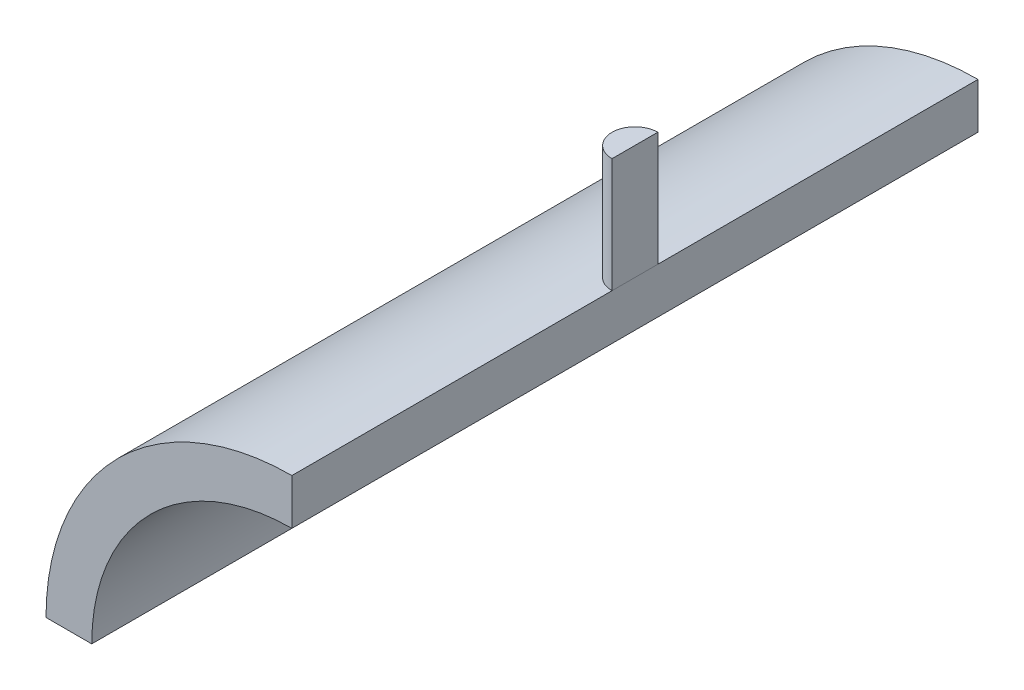
ISO-10303-21;
HEADER;
FILE_DESCRIPTION(('STEP AP214'),'2;1');
FILE_NAME('part.step','',(''),(''),'','','');
FILE_SCHEMA(('AUTOMOTIVE_DESIGN { 1 0 10303 214 1 1 1 1 }'));
ENDSEC;
DATA;
#1=APPLICATION_CONTEXT('core data for automotive mechanical design processes');
#2=APPLICATION_PROTOCOL_DEFINITION('international standard','automotive_design',2000,#1);
#3=PRODUCT_CONTEXT('',#1,'mechanical');
#4=PRODUCT('Part','Part','',(#3));
#5=PRODUCT_RELATED_PRODUCT_CATEGORY('part','',(#4));
#6=PRODUCT_DEFINITION_FORMATION('','',#4);
#7=PRODUCT_DEFINITION_CONTEXT('part definition',#1,'design');
#8=PRODUCT_DEFINITION('design','',#6,#7);
#9=PRODUCT_DEFINITION_SHAPE('','',#8);
#10=(LENGTH_UNIT() NAMED_UNIT(*) SI_UNIT(.MILLI.,.METRE.));
#11=(NAMED_UNIT(*) PLANE_ANGLE_UNIT() SI_UNIT($,.RADIAN.));
#12=(NAMED_UNIT(*) SI_UNIT($,.STERADIAN.) SOLID_ANGLE_UNIT());
#13=UNCERTAINTY_MEASURE_WITH_UNIT(LENGTH_MEASURE(1.E-05),#10,'distance_accuracy_value','');
#14=(GEOMETRIC_REPRESENTATION_CONTEXT(3) GLOBAL_UNCERTAINTY_ASSIGNED_CONTEXT((#13)) GLOBAL_UNIT_ASSIGNED_CONTEXT((#10,
#11,#12)) REPRESENTATION_CONTEXT('',''));
#15=CARTESIAN_POINT('',(0.,0.,0.));
#16=DIRECTION('',(0.,0.,1.));
#17=DIRECTION('',(1.,0.,0.));
#18=AXIS2_PLACEMENT_3D('',#15,#16,#17);
#19=CARTESIAN_POINT('',(0.,0.,76.2));
#20=DIRECTION('',(0.,0.,-1.));
#21=DIRECTION('',(-1.,0.,0.));
#22=AXIS2_PLACEMENT_3D('',#19,#20,#21);
#23=CYLINDRICAL_SURFACE('',#22,27.305);
#24=DIRECTION('',(0.,0.,-1.));
#25=VECTOR('',#24,1.);
#26=CARTESIAN_POINT('',(0.,27.305,35.56));
#27=LINE('',#26,#25);
#28=CARTESIAN_POINT('',(0.,27.305,40.64));
#29=VERTEX_POINT('',#28);
#30=CARTESIAN_POINT('',(0.,27.305,35.56));
#31=VERTEX_POINT('',#30);
#32=EDGE_CURVE('E12',#29,#31,#27,.T.);
#33=ORIENTED_EDGE('',*,*,#32,.F.);
#34=CARTESIAN_POINT('',(0.,27.305,35.56));
#35=CARTESIAN_POINT('',(-0.0712761745581656,27.305002704359,35.559992977723));
#36=CARTESIAN_POINT('',(-0.142548897038713,27.3047209710686,35.5630001352108));
#37=CARTESIAN_POINT('',(-0.28458143273031,27.3036086104742,35.5749884382365));
#38=CARTESIAN_POINT('',(-0.355341278320255,27.3027780181311,35.5839692032693));
#39=CARTESIAN_POINT('',(-0.495789516985236,27.3005888783886,35.6078398685261));
#40=CARTESIAN_POINT('',(-0.565478797075577,27.2992307956366,35.6227245684291));
#41=CARTESIAN_POINT('',(-0.703333163421718,27.2960273886493,35.6582799844524));
#42=CARTESIAN_POINT('',(-0.771498263081333,27.2941820687007,35.6789506496687));
#43=CARTESIAN_POINT('',(-0.973038770785745,27.2879864866015,35.7494659107561));
#44=CARTESIAN_POINT('',(-1.10352975776769,27.2829754296935,35.8078258023717));
#45=CARTESIAN_POINT('',(-1.35277461515994,27.2717555192625,35.9454935457507));
#46=CARTESIAN_POINT('',(-1.47153002473506,27.2655468231306,36.0247986454479));
#47=CARTESIAN_POINT('',(-1.69440518085302,27.2526056988025,36.2023869427999));
#48=CARTESIAN_POINT('',(-1.798484624796,27.2458719043398,36.3007207067473));
#49=CARTESIAN_POINT('',(-1.98869404359857,27.2326502648965,36.513473962815));
#50=CARTESIAN_POINT('',(-2.07482127601813,27.2261624576175,36.6278959081556));
#51=CARTESIAN_POINT('',(-2.22681699282527,27.2141535618347,36.8698257453777));
#52=CARTESIAN_POINT('',(-2.29264864154293,27.2086342388194,36.9973568772253));
#53=CARTESIAN_POINT('',(-2.40194373906475,27.1992043730304,37.2617148963497));
#54=CARTESIAN_POINT('',(-2.44540902335816,27.1952936982486,37.3985410197919));
#55=CARTESIAN_POINT('',(-2.50862211302221,27.1895357622463,37.6771922536974));
#56=CARTESIAN_POINT('',(-2.52843820540104,27.187682561159,37.8190017480177));
#57=CARTESIAN_POINT('',(-2.5440013936356,27.186230821562,38.1039485919509));
#58=CARTESIAN_POINT('',(-2.53974845292076,27.186632286478,38.247085943581));
#59=CARTESIAN_POINT('',(-2.50734984015752,27.1896391824742,38.530147991177));
#60=CARTESIAN_POINT('',(-2.47927927532233,27.1922376852585,38.6700813676771));
#61=CARTESIAN_POINT('',(-2.40015911412824,27.1993350170393,38.9432413143619));
#62=CARTESIAN_POINT('',(-2.34910935768062,27.2038338592748,39.0764678378149));
#63=CARTESIAN_POINT('',(-2.22539540347622,27.2142330499727,39.3326736791895));
#64=CARTESIAN_POINT('',(-2.15269728290109,27.2201355950813,39.4556365239417));
#65=CARTESIAN_POINT('',(-1.98777788437432,27.2326748504776,39.6876380791451));
#66=CARTESIAN_POINT('',(-1.89555699442021,27.2393115461736,39.7966770662515));
#67=CARTESIAN_POINT('',(-1.69380448534262,27.2526014698176,39.9981643004209));
#68=CARTESIAN_POINT('',(-1.58421039735372,27.2592546686998,40.0905500019832));
#69=CARTESIAN_POINT('',(-1.35099313670298,27.2718069402296,40.2556506940644));
#70=CARTESIAN_POINT('',(-1.22736569195286,27.2777057820645,40.3283596716007));
#71=CARTESIAN_POINT('',(-0.969532831636801,27.2880869537317,40.4520373538065));
#72=CARTESIAN_POINT('',(-0.835319682981221,27.2925682358043,40.5029899874157));
#73=CARTESIAN_POINT('',(-0.56029292449324,27.299595723035,40.5815433175172));
#74=CARTESIAN_POINT('',(-0.419489650561029,27.3021448572683,40.609179368438));
#75=CARTESIAN_POINT('',(-0.231422870442125,27.304058767318,40.6298634781072));
#76=CARTESIAN_POINT('',(-0.18517977183952,27.3044115191117,40.6336665793864));
#77=CARTESIAN_POINT('',(-0.0926308509235826,27.3048818410604,40.6387314024149));
#78=CARTESIAN_POINT('',(-0.046325262536238,27.3049998032111,40.6399973601063));
#79=CARTESIAN_POINT('',(0.,27.305,40.64));
#80=B_SPLINE_CURVE_WITH_KNOTS('',3,(#34,#35,#36,#37,#38,#39,#40,#41,#42,#43,#44,#45,#46,#47,#48,
#49,#50,#51,#52,#53,#54,#55,#56,#57,#58,#59,#60,#61,#62,#63,#64,#65,#66,#67,#68,#69,#70,#71,#72,
#73,#74,#75,#76,#77,#78,#79),.UNSPECIFIED.,.F.,.F.,(4,2,2,2,2,2,2,2,2,2,2,2,2,2,2,2,2,2,2,2,2,2,
4),(0.,0.213758377391474,0.427503140166232,0.641060048264209,0.854615077579251,1.28151363150623,
1.70835612157803,2.13634886734063,2.56440694687003,2.99323742203204,3.42203269973012,
3.84958681262588,4.27714157514931,4.70335306310955,5.12956752039574,5.55645339873055,
5.98333079388765,6.41177946422457,6.84035891612098,7.26925440734802,7.69749839888946,
7.83664993509868,7.9755689537086),.UNSPECIFIED.);
#81=EDGE_CURVE('E58',#31,#29,#80,.T.);
#82=ORIENTED_EDGE('',*,*,#81,.F.);
#83=EDGE_LOOP('',(#33,#82));
#84=FACE_BOUND('',#83,.T.);
#85=ADVANCED_FACE('F49',(#84),#23,.F.);
#86=CARTESIAN_POINT('',(0.,-0.00199999999999853,38.1));
#87=DIRECTION('',(0.,1.,0.));
#88=DIRECTION('',(0.,0.,1.));
#89=AXIS2_PLACEMENT_3D('',#86,#87,#88);
#90=CYLINDRICAL_SURFACE('',#89,2.54);
#91=ORIENTED_EDGE('',*,*,#81,.T.);
#92=DIRECTION('',(0.,-1.,0.));
#93=VECTOR('',#92,1.);
#94=CARTESIAN_POINT('',(0.,40.005,40.64));
#95=LINE('',#94,#93);
#96=CARTESIAN_POINT('',(0.,40.005,40.64));
#97=VERTEX_POINT('',#96);
#98=EDGE_CURVE('E78',#97,#29,#95,.T.);
#99=ORIENTED_EDGE('',*,*,#98,.F.);
#100=CARTESIAN_POINT('',(0.,40.005,38.1));
#101=DIRECTION('',(0.,1.,0.));
#102=DIRECTION('',(0.,0.,1.));
#103=AXIS2_PLACEMENT_3D('',#100,#101,#102);
#104=CIRCLE('',#103,2.54);
#105=CARTESIAN_POINT('',(0.,40.005,35.56));
#106=VERTEX_POINT('',#105);
#107=EDGE_CURVE('E83',#106,#97,#104,.T.);
#108=ORIENTED_EDGE('',*,*,#107,.F.);
#109=DIRECTION('',(0.,-1.,0.));
#110=VECTOR('',#109,1.);
#111=CARTESIAN_POINT('',(0.,40.005,35.56));
#112=LINE('',#111,#110);
#113=EDGE_CURVE('E81',#106,#31,#112,.T.);
#114=ORIENTED_EDGE('',*,*,#113,.T.);
#115=EDGE_LOOP('',(#91,#99,#108,#114));
#116=FACE_BOUND('',#115,.T.);
#117=ADVANCED_FACE('F51',(#116),#90,.T.);
#118=CARTESIAN_POINT('',(0.,40.005,35.56));
#119=DIRECTION('',(-1.,0.,0.));
#120=DIRECTION('',(0.,0.,1.));
#121=AXIS2_PLACEMENT_3D('',#118,#119,#120);
#122=PLANE('',#121);
#123=ORIENTED_EDGE('',*,*,#32,.T.);
#124=ORIENTED_EDGE('',*,*,#113,.F.);
#125=DIRECTION('',(0.,0.,-1.));
#126=VECTOR('',#125,1.);
#127=CARTESIAN_POINT('',(0.,40.005,35.56));
#128=LINE('',#127,#126);
#129=EDGE_CURVE('E72',#97,#106,#128,.T.);
#130=ORIENTED_EDGE('',*,*,#129,.F.);
#131=ORIENTED_EDGE('',*,*,#98,.T.);
#132=EDGE_LOOP('',(#123,#124,#130,#131));
#133=FACE_BOUND('',#132,.T.);
#134=ADVANCED_FACE('F80',(#133),#122,.F.);
#135=CARTESIAN_POINT('',(0.,40.005,38.1));
#136=DIRECTION('',(0.,1.,0.));
#137=DIRECTION('',(0.,0.,1.));
#138=AXIS2_PLACEMENT_3D('',#135,#136,#137);
#139=PLANE('',#138);
#140=ORIENTED_EDGE('',*,*,#107,.T.);
#141=ORIENTED_EDGE('',*,*,#129,.T.);
#142=EDGE_LOOP('',(#140,#141));
#143=FACE_BOUND('',#142,.T.);
#144=ADVANCED_FACE('F97',(#143),#139,.T.);
#145=CLOSED_SHELL('',(#85,#117,#134,#144));
#146=MANIFOLD_SOLID_BREP('B2',#145);
#147=CARTESIAN_POINT('',(0.,0.,76.2));
#148=DIRECTION('',(0.,0.,-1.));
#149=DIRECTION('',(-1.,0.,0.));
#150=AXIS2_PLACEMENT_3D('',#147,#148,#149);
#151=CYLINDRICAL_SURFACE('',#150,22.225);
#152=CARTESIAN_POINT('',(0.,0.,0.));
#153=DIRECTION('',(0.,0.,-1.));
#154=DIRECTION('',(-1.,0.,0.));
#155=AXIS2_PLACEMENT_3D('',#152,#153,#154);
#156=CIRCLE('',#155,22.225);
#157=CARTESIAN_POINT('',(-22.225,0.,0.));
#158=VERTEX_POINT('',#157);
#159=CARTESIAN_POINT('',(0.,22.225,0.));
#160=VERTEX_POINT('',#159);
#161=EDGE_CURVE('E206',#158,#160,#156,.T.);
#162=ORIENTED_EDGE('',*,*,#161,.T.);
#163=DIRECTION('',(0.,0.,-1.));
#164=VECTOR('',#163,1.);
#165=CARTESIAN_POINT('',(0.,22.225,76.2));
#166=LINE('',#165,#164);
#167=CARTESIAN_POINT('',(0.,22.225,76.2));
#168=VERTEX_POINT('',#167);
#169=EDGE_CURVE('E47',#168,#160,#166,.T.);
#170=ORIENTED_EDGE('',*,*,#169,.F.);
#171=CARTESIAN_POINT('',(0.,0.,76.2));
#172=DIRECTION('',(0.,0.,-1.));
#173=DIRECTION('',(-1.,0.,0.));
#174=AXIS2_PLACEMENT_3D('',#171,#172,#173);
#175=CIRCLE('',#174,22.225);
#176=CARTESIAN_POINT('',(-22.225,0.,76.2));
#177=VERTEX_POINT('',#176);
#178=EDGE_CURVE('E194',#177,#168,#175,.T.);
#179=ORIENTED_EDGE('',*,*,#178,.F.);
#180=DIRECTION('',(0.,0.,-1.));
#181=VECTOR('',#180,1.);
#182=CARTESIAN_POINT('',(-22.225,0.,76.2));
#183=LINE('',#182,#181);
#184=EDGE_CURVE('E202',#177,#158,#183,.T.);
#185=ORIENTED_EDGE('',*,*,#184,.T.);
#186=EDGE_LOOP('',(#162,#170,#179,#185));
#187=FACE_BOUND('',#186,.T.);
#188=ADVANCED_FACE('F143',(#187),#151,.F.);
#189=CARTESIAN_POINT('',(0.,22.225,76.2));
#190=DIRECTION('',(-1.,0.,0.));
#191=DIRECTION('',(0.,0.,1.));
#192=AXIS2_PLACEMENT_3D('',#189,#190,#191);
#193=PLANE('',#192);
#194=DIRECTION('',(0.,1.,0.));
#195=VECTOR('',#194,1.);
#196=CARTESIAN_POINT('',(0.,22.225,0.));
#197=LINE('',#196,#195);
#198=CARTESIAN_POINT('',(0.,27.305,0.));
#199=VERTEX_POINT('',#198);
#200=EDGE_CURVE('E198',#160,#199,#197,.T.);
#201=ORIENTED_EDGE('',*,*,#200,.T.);
#202=DIRECTION('',(0.,0.,-1.));
#203=VECTOR('',#202,1.);
#204=CARTESIAN_POINT('',(0.,27.305,76.2));
#205=LINE('',#204,#203);
#206=CARTESIAN_POINT('',(0.,27.305,76.2));
#207=VERTEX_POINT('',#206);
#208=EDGE_CURVE('E151',#207,#199,#205,.T.);
#209=ORIENTED_EDGE('',*,*,#208,.F.);
#210=DIRECTION('',(0.,1.,0.));
#211=VECTOR('',#210,1.);
#212=CARTESIAN_POINT('',(0.,22.225,76.2));
#213=LINE('',#212,#211);
#214=EDGE_CURVE('E189',#168,#207,#213,.T.);
#215=ORIENTED_EDGE('',*,*,#214,.F.);
#216=ORIENTED_EDGE('',*,*,#169,.T.);
#217=EDGE_LOOP('',(#201,#209,#215,#216));
#218=FACE_BOUND('',#217,.T.);
#219=ADVANCED_FACE('F197',(#218),#193,.F.);
#220=CARTESIAN_POINT('',(0.,0.,76.2));
#221=DIRECTION('',(0.,0.,-1.));
#222=DIRECTION('',(-1.,0.,0.));
#223=AXIS2_PLACEMENT_3D('',#220,#221,#222);
#224=CYLINDRICAL_SURFACE('',#223,27.305);
#225=CARTESIAN_POINT('',(0.,0.,0.));
#226=DIRECTION('',(0.,0.,1.));
#227=DIRECTION('',(-1.,0.,0.));
#228=AXIS2_PLACEMENT_3D('',#225,#226,#227);
#229=CIRCLE('',#228,27.305);
#230=CARTESIAN_POINT('',(-27.305,0.,0.));
#231=VERTEX_POINT('',#230);
#232=EDGE_CURVE('E176',#199,#231,#229,.T.);
#233=ORIENTED_EDGE('',*,*,#232,.T.);
#234=DIRECTION('',(0.,0.,-1.));
#235=VECTOR('',#234,1.);
#236=CARTESIAN_POINT('',(-27.305,0.,76.2));
#237=LINE('',#236,#235);
#238=CARTESIAN_POINT('',(-27.305,0.,76.2));
#239=VERTEX_POINT('',#238);
#240=EDGE_CURVE('E199',#239,#231,#237,.T.);
#241=ORIENTED_EDGE('',*,*,#240,.F.);
#242=CARTESIAN_POINT('',(0.,0.,76.2));
#243=DIRECTION('',(0.,0.,1.));
#244=DIRECTION('',(-1.,0.,0.));
#245=AXIS2_PLACEMENT_3D('',#242,#243,#244);
#246=CIRCLE('',#245,27.305);
#247=EDGE_CURVE('E192',#207,#239,#246,.T.);
#248=ORIENTED_EDGE('',*,*,#247,.F.);
#249=ORIENTED_EDGE('',*,*,#208,.T.);
#250=EDGE_LOOP('',(#233,#241,#248,#249));
#251=FACE_BOUND('',#250,.T.);
#252=ADVANCED_FACE('F200',(#251),#224,.T.);
#253=CARTESIAN_POINT('',(-27.305,0.,76.2));
#254=DIRECTION('',(0.,1.,0.));
#255=DIRECTION('',(0.,0.,1.));
#256=AXIS2_PLACEMENT_3D('',#253,#254,#255);
#257=PLANE('',#256);
#258=DIRECTION('',(1.,0.,0.));
#259=VECTOR('',#258,1.);
#260=CARTESIAN_POINT('',(-27.305,0.,0.));
#261=LINE('',#260,#259);
#262=EDGE_CURVE('E182',#231,#158,#261,.T.);
#263=ORIENTED_EDGE('',*,*,#262,.T.);
#264=ORIENTED_EDGE('',*,*,#184,.F.);
#265=DIRECTION('',(1.,0.,0.));
#266=VECTOR('',#265,1.);
#267=CARTESIAN_POINT('',(-27.305,0.,76.2));
#268=LINE('',#267,#266);
#269=EDGE_CURVE('E159',#239,#177,#268,.T.);
#270=ORIENTED_EDGE('',*,*,#269,.F.);
#271=ORIENTED_EDGE('',*,*,#240,.T.);
#272=EDGE_LOOP('',(#263,#264,#270,#271));
#273=FACE_BOUND('',#272,.T.);
#274=ADVANCED_FACE('F213',(#273),#257,.F.);
#275=CARTESIAN_POINT('',(0.,0.,76.2));
#276=DIRECTION('',(0.,0.,-1.));
#277=DIRECTION('',(-1.,0.,0.));
#278=AXIS2_PLACEMENT_3D('',#275,#276,#277);
#279=PLANE('',#278);
#280=ORIENTED_EDGE('',*,*,#178,.T.);
#281=ORIENTED_EDGE('',*,*,#214,.T.);
#282=ORIENTED_EDGE('',*,*,#247,.T.);
#283=ORIENTED_EDGE('',*,*,#269,.T.);
#284=EDGE_LOOP('',(#280,#281,#282,#283));
#285=FACE_BOUND('',#284,.T.);
#286=ADVANCED_FACE('F190',(#285),#279,.F.);
#287=CARTESIAN_POINT('',(0.,0.,0.));
#288=DIRECTION('',(0.,0.,-1.));
#289=DIRECTION('',(-1.,0.,0.));
#290=AXIS2_PLACEMENT_3D('',#287,#288,#289);
#291=PLANE('',#290);
#292=ORIENTED_EDGE('',*,*,#161,.F.);
#293=ORIENTED_EDGE('',*,*,#262,.F.);
#294=ORIENTED_EDGE('',*,*,#232,.F.);
#295=ORIENTED_EDGE('',*,*,#200,.F.);
#296=EDGE_LOOP('',(#292,#293,#294,#295));
#297=FACE_BOUND('',#296,.T.);
#298=ADVANCED_FACE('F216',(#297),#291,.T.);
#299=CLOSED_SHELL('',(#188,#219,#252,#274,#286,#298));
#300=MANIFOLD_SOLID_BREP('B6',#299);
#301=ADVANCED_BREP_SHAPE_REPRESENTATION('',(#18,#146,#300),#14);
#302=SHAPE_DEFINITION_REPRESENTATION(#9,#301);
ENDSEC;
END-ISO-10303-21;
